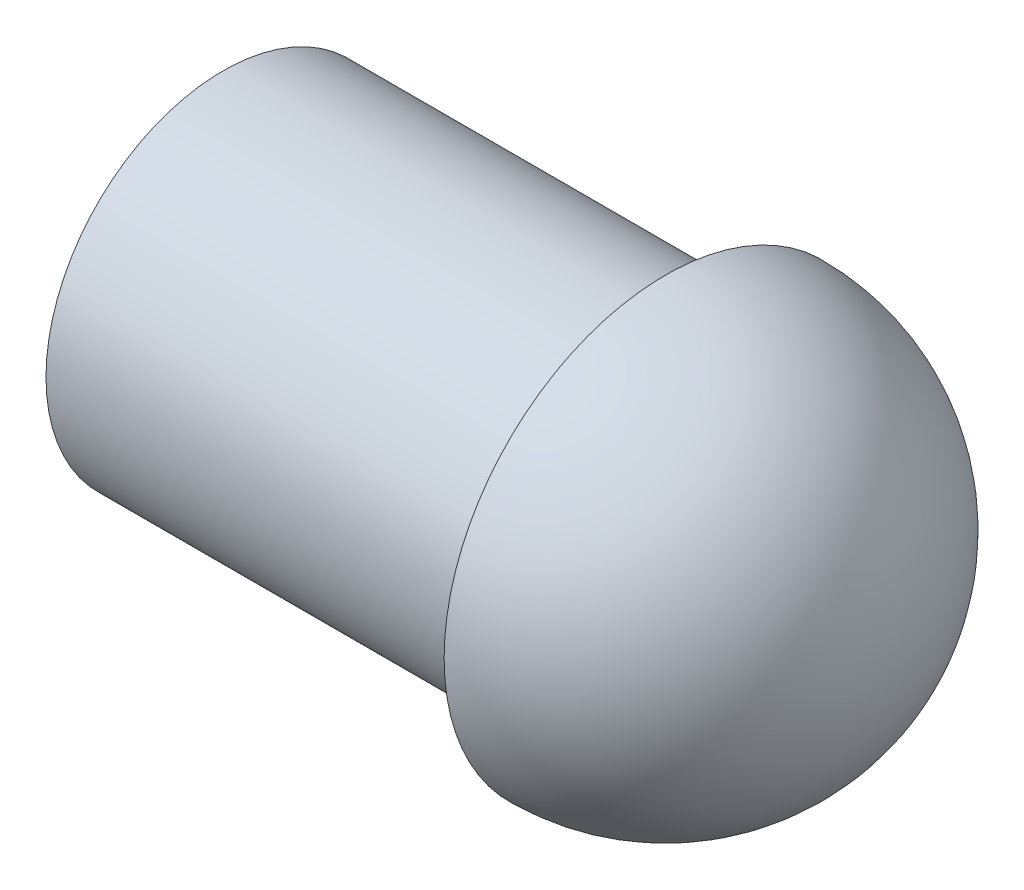
ISO-10303-21;
HEADER;
FILE_DESCRIPTION(('STEP AP214'),'2;1');
FILE_NAME('part.step','',(''),(''),'','','');
FILE_SCHEMA(('AUTOMOTIVE_DESIGN { 1 0 10303 214 1 1 1 1 }'));
ENDSEC;
DATA;
#1=APPLICATION_CONTEXT('core data for automotive mechanical design processes');
#2=APPLICATION_PROTOCOL_DEFINITION('international standard','automotive_design',2000,#1);
#3=PRODUCT_CONTEXT('',#1,'mechanical');
#4=PRODUCT('Part','Part','',(#3));
#5=PRODUCT_RELATED_PRODUCT_CATEGORY('part','',(#4));
#6=PRODUCT_DEFINITION_FORMATION('','',#4);
#7=PRODUCT_DEFINITION_CONTEXT('part definition',#1,'design');
#8=PRODUCT_DEFINITION('design','',#6,#7);
#9=PRODUCT_DEFINITION_SHAPE('','',#8);
#10=(LENGTH_UNIT() NAMED_UNIT(*) SI_UNIT(.MILLI.,.METRE.));
#11=(NAMED_UNIT(*) PLANE_ANGLE_UNIT() SI_UNIT($,.RADIAN.));
#12=(NAMED_UNIT(*) SI_UNIT($,.STERADIAN.) SOLID_ANGLE_UNIT());
#13=UNCERTAINTY_MEASURE_WITH_UNIT(LENGTH_MEASURE(1.E-05),#10,'distance_accuracy_value','');
#14=(GEOMETRIC_REPRESENTATION_CONTEXT(3) GLOBAL_UNCERTAINTY_ASSIGNED_CONTEXT((#13)) GLOBAL_UNIT_ASSIGNED_CONTEXT((#10,
#11,#12)) REPRESENTATION_CONTEXT('',''));
#15=CARTESIAN_POINT('',(0.,0.,0.));
#16=DIRECTION('',(0.,0.,1.));
#17=DIRECTION('',(1.,0.,0.));
#18=AXIS2_PLACEMENT_3D('',#15,#16,#17);
#19=CARTESIAN_POINT('',(0.,12.5,0.));
#20=DIRECTION('',(0.,1.,0.));
#21=DIRECTION('',(0.,0.,1.));
#22=AXIS2_PLACEMENT_3D('',#19,#20,#21);
#23=SPHERICAL_SURFACE('',#22,12.5);
#24=CARTESIAN_POINT('',(0.,12.5,0.));
#25=DIRECTION('',(-1.,0.,0.));
#26=DIRECTION('',(0.,0.,-1.));
#27=AXIS2_PLACEMENT_3D('',#24,#25,#26);
#28=SPHERICAL_SURFACE('',#27,12.5);
#29=CARTESIAN_POINT('',(0.,12.5,0.));
#30=DIRECTION('',(-1.,0.,0.));
#31=DIRECTION('',(0.,0.,-1.));
#32=AXIS2_PLACEMENT_3D('',#29,#30,#31);
#33=CIRCLE('',#32,12.5);
#34=CARTESIAN_POINT('',(0.,12.5,-12.5));
#35=VERTEX_POINT('',#34);
#36=EDGE_CURVE('E39',#35,#35,#33,.T.);
#37=ORIENTED_EDGE('',*,*,#36,.F.);
#38=EDGE_LOOP('',(#37));
#39=FACE_BOUND('',#38,.T.);
#40=ADVANCED_FACE('F33',(#39),#28,.T.);
#41=CARTESIAN_POINT('',(0.,12.5,0.));
#42=DIRECTION('',(1.,0.,0.));
#43=DIRECTION('',(0.,0.,-1.));
#44=AXIS2_PLACEMENT_3D('',#41,#42,#43);
#45=PLANE('',#44);
#46=CARTESIAN_POINT('',(0.,12.5,0.));
#47=DIRECTION('',(1.,0.,0.));
#48=DIRECTION('',(0.,0.,-1.));
#49=AXIS2_PLACEMENT_3D('',#46,#47,#48);
#50=CIRCLE('',#49,10.);
#51=CARTESIAN_POINT('',(0.,12.5,-10.));
#52=VERTEX_POINT('',#51);
#53=EDGE_CURVE('E10',#52,#52,#50,.F.);
#54=ORIENTED_EDGE('',*,*,#53,.F.);
#55=EDGE_LOOP('',(#54));
#56=FACE_BOUND('',#55,.T.);
#57=ORIENTED_EDGE('',*,*,#36,.T.);
#58=EDGE_LOOP('',(#57));
#59=FACE_BOUND('',#58,.T.);
#60=ADVANCED_FACE('F62',(#56,#59),#45,.F.);
#61=CARTESIAN_POINT('',(-25.,12.5,-1.76940393289594E-13));
#62=DIRECTION('',(-1.,0.,0.));
#63=DIRECTION('',(0.,0.,1.));
#64=AXIS2_PLACEMENT_3D('',#61,#62,#63);
#65=PLANE('',#64);
#66=CARTESIAN_POINT('',(-25.,12.5,-1.76940393289594E-13));
#67=DIRECTION('',(-1.,0.,0.));
#68=DIRECTION('',(0.,0.,1.));
#69=AXIS2_PLACEMENT_3D('',#66,#67,#68);
#70=CIRCLE('',#69,10.);
#71=CARTESIAN_POINT('',(-25.0000000000001,12.5,9.99999999999982));
#72=VERTEX_POINT('',#71);
#73=EDGE_CURVE('E43',#72,#72,#70,.T.);
#74=ORIENTED_EDGE('',*,*,#73,.T.);
#75=EDGE_LOOP('',(#74));
#76=FACE_BOUND('',#75,.T.);
#77=CARTESIAN_POINT('',(-25.,12.5,-1.76940393289594E-13));
#78=DIRECTION('',(-1.,0.,0.));
#79=DIRECTION('',(0.,0.,1.));
#80=AXIS2_PLACEMENT_3D('',#77,#78,#79);
#81=CIRCLE('',#80,2.5);
#82=CARTESIAN_POINT('',(-25.,12.5,2.49999999999982));
#83=VERTEX_POINT('',#82);
#84=EDGE_CURVE('E47',#83,#83,#81,.T.);
#85=ORIENTED_EDGE('',*,*,#84,.F.);
#86=EDGE_LOOP('',(#85));
#87=FACE_BOUND('',#86,.T.);
#88=ADVANCED_FACE('F59',(#76,#87),#65,.T.);
#89=CARTESIAN_POINT('',(-25.,12.5,-1.76940393289594E-13));
#90=DIRECTION('',(1.,0.,0.));
#91=DIRECTION('',(0.,0.,-1.));
#92=AXIS2_PLACEMENT_3D('',#89,#90,#91);
#93=CYLINDRICAL_SURFACE('',#92,10.);
#94=ORIENTED_EDGE('',*,*,#73,.F.);
#95=EDGE_LOOP('',(#94));
#96=FACE_BOUND('',#95,.T.);
#97=ORIENTED_EDGE('',*,*,#53,.T.);
#98=EDGE_LOOP('',(#97));
#99=FACE_BOUND('',#98,.T.);
#100=ADVANCED_FACE('F61',(#96,#99),#93,.T.);
#101=CARTESIAN_POINT('',(-25.,12.5,-1.76940393289594E-13));
#102=DIRECTION('',(1.,0.,0.));
#103=DIRECTION('',(0.,0.,-1.));
#104=AXIS2_PLACEMENT_3D('',#101,#102,#103);
#105=CYLINDRICAL_SURFACE('',#104,2.5);
#106=ORIENTED_EDGE('',*,*,#84,.T.);
#107=EDGE_LOOP('',(#106));
#108=FACE_BOUND('',#107,.T.);
#109=CARTESIAN_POINT('',(0.,12.5,0.));
#110=DIRECTION('',(-1.,0.,0.));
#111=DIRECTION('',(0.,0.,1.));
#112=AXIS2_PLACEMENT_3D('',#109,#110,#111);
#113=CIRCLE('',#112,2.5);
#114=CARTESIAN_POINT('',(0.,12.5,2.5));
#115=VERTEX_POINT('',#114);
#116=EDGE_CURVE('E50',#115,#115,#113,.T.);
#117=ORIENTED_EDGE('',*,*,#116,.F.);
#118=EDGE_LOOP('',(#117));
#119=FACE_BOUND('',#118,.T.);
#120=ADVANCED_FACE('F56',(#108,#119),#105,.F.);
#121=ORIENTED_EDGE('',*,*,#116,.T.);
#122=EDGE_LOOP('',(#121));
#123=FACE_BOUND('',#122,.T.);
#124=ADVANCED_FACE('F72',(#123),#45,.F.);
#125=CLOSED_SHELL('',(#40,#60,#88,#100,#120,#124));
#126=MANIFOLD_SOLID_BREP('B2',#125);
#127=ADVANCED_BREP_SHAPE_REPRESENTATION('',(#18,#126),#14);
#128=SHAPE_DEFINITION_REPRESENTATION(#9,#127);
ENDSEC;
END-ISO-10303-21;
